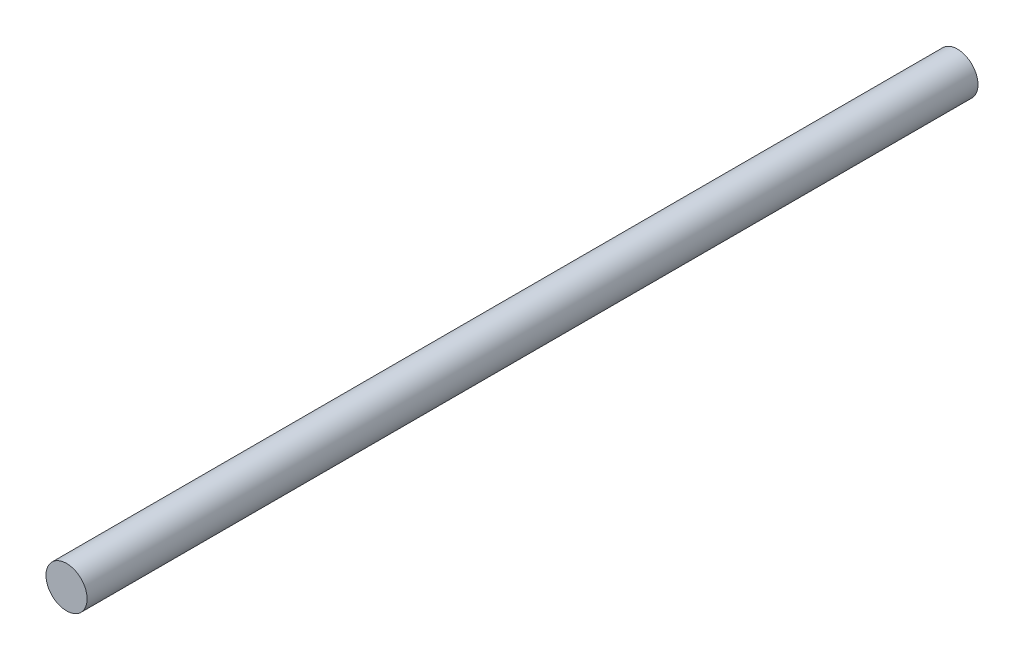
ISO-10303-21;
HEADER;
FILE_DESCRIPTION(('STEP AP214'),'2;1');
FILE_NAME('part.step','',(''),(''),'','','');
FILE_SCHEMA(('AUTOMOTIVE_DESIGN { 1 0 10303 214 1 1 1 1 }'));
ENDSEC;
DATA;
#1=APPLICATION_CONTEXT('core data for automotive mechanical design processes');
#2=APPLICATION_PROTOCOL_DEFINITION('international standard','automotive_design',2000,#1);
#3=PRODUCT_CONTEXT('',#1,'mechanical');
#4=PRODUCT('Part','Part','',(#3));
#5=PRODUCT_RELATED_PRODUCT_CATEGORY('part','',(#4));
#6=PRODUCT_DEFINITION_FORMATION('','',#4);
#7=PRODUCT_DEFINITION_CONTEXT('part definition',#1,'design');
#8=PRODUCT_DEFINITION('design','',#6,#7);
#9=PRODUCT_DEFINITION_SHAPE('','',#8);
#10=(LENGTH_UNIT() NAMED_UNIT(*) SI_UNIT(.MILLI.,.METRE.));
#11=(NAMED_UNIT(*) PLANE_ANGLE_UNIT() SI_UNIT($,.RADIAN.));
#12=(NAMED_UNIT(*) SI_UNIT($,.STERADIAN.) SOLID_ANGLE_UNIT());
#13=UNCERTAINTY_MEASURE_WITH_UNIT(LENGTH_MEASURE(1.E-05),#10,'distance_accuracy_value','');
#14=(GEOMETRIC_REPRESENTATION_CONTEXT(3) GLOBAL_UNCERTAINTY_ASSIGNED_CONTEXT((#13)) GLOBAL_UNIT_ASSIGNED_CONTEXT((#10,
#11,#12)) REPRESENTATION_CONTEXT('',''));
#15=CARTESIAN_POINT('',(0.,0.,0.));
#16=DIRECTION('',(0.,0.,1.));
#17=DIRECTION('',(1.,0.,0.));
#18=AXIS2_PLACEMENT_3D('',#15,#16,#17);
#19=CARTESIAN_POINT('',(0.,0.,137.45083));
#20=DIRECTION('',(0.,0.,-1.));
#21=DIRECTION('',(-1.,0.,0.));
#22=AXIS2_PLACEMENT_3D('',#19,#20,#21);
#23=CYLINDRICAL_SURFACE('',#22,6.35);
#24=CARTESIAN_POINT('',(0.,0.,137.45083));
#25=DIRECTION('',(0.,0.,1.));
#26=DIRECTION('',(1.,0.,0.));
#27=AXIS2_PLACEMENT_3D('',#24,#25,#26);
#28=CIRCLE('',#27,6.35);
#29=CARTESIAN_POINT('',(6.35,0.,137.45083));
#30=VERTEX_POINT('',#29);
#31=EDGE_CURVE('E10',#30,#30,#28,.T.);
#32=ORIENTED_EDGE('',*,*,#31,.F.);
#33=EDGE_LOOP('',(#32));
#34=FACE_BOUND('',#33,.T.);
#35=CARTESIAN_POINT('',(0.,0.,-137.45083));
#36=DIRECTION('',(0.,0.,1.));
#37=DIRECTION('',(1.,0.,0.));
#38=AXIS2_PLACEMENT_3D('',#35,#36,#37);
#39=CIRCLE('',#38,6.35);
#40=CARTESIAN_POINT('',(6.35,0.,-137.45083));
#41=VERTEX_POINT('',#40);
#42=EDGE_CURVE('E33',#41,#41,#39,.T.);
#43=ORIENTED_EDGE('',*,*,#42,.T.);
#44=EDGE_LOOP('',(#43));
#45=FACE_BOUND('',#44,.T.);
#46=ADVANCED_FACE('F30',(#34,#45),#23,.T.);
#47=CARTESIAN_POINT('',(0.,0.,137.45083));
#48=DIRECTION('',(0.,0.,1.));
#49=DIRECTION('',(1.,0.,0.));
#50=AXIS2_PLACEMENT_3D('',#47,#48,#49);
#51=PLANE('',#50);
#52=ORIENTED_EDGE('',*,*,#31,.T.);
#53=EDGE_LOOP('',(#52));
#54=FACE_BOUND('',#53,.T.);
#55=ADVANCED_FACE('F45',(#54),#51,.T.);
#56=CARTESIAN_POINT('',(0.,0.,-137.45083));
#57=DIRECTION('',(0.,0.,1.));
#58=DIRECTION('',(1.,0.,0.));
#59=AXIS2_PLACEMENT_3D('',#56,#57,#58);
#60=PLANE('',#59);
#61=ORIENTED_EDGE('',*,*,#42,.F.);
#62=EDGE_LOOP('',(#61));
#63=FACE_BOUND('',#62,.T.);
#64=ADVANCED_FACE('F43',(#63),#60,.F.);
#65=CLOSED_SHELL('',(#46,#55,#64));
#66=MANIFOLD_SOLID_BREP('B2',#65);
#67=ADVANCED_BREP_SHAPE_REPRESENTATION('',(#18,#66),#14);
#68=SHAPE_DEFINITION_REPRESENTATION(#9,#67);
ENDSEC;
END-ISO-10303-21;
